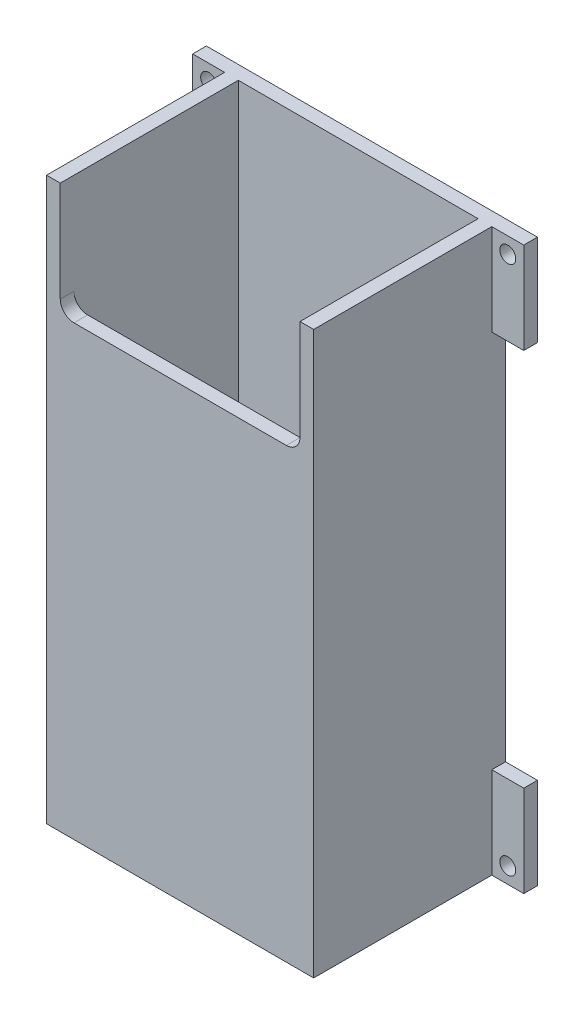
ISO-10303-21;
HEADER;
FILE_DESCRIPTION(('STEP AP214'),'2;1');
FILE_NAME('part.step','',(''),(''),'','','');
FILE_SCHEMA(('AUTOMOTIVE_DESIGN { 1 0 10303 214 1 1 1 1 }'));
ENDSEC;
DATA;
#1=APPLICATION_CONTEXT('core data for automotive mechanical design processes');
#2=APPLICATION_PROTOCOL_DEFINITION('international standard','automotive_design',2000,#1);
#3=PRODUCT_CONTEXT('',#1,'mechanical');
#4=PRODUCT('Part','Part','',(#3));
#5=PRODUCT_RELATED_PRODUCT_CATEGORY('part','',(#4));
#6=PRODUCT_DEFINITION_FORMATION('','',#4);
#7=PRODUCT_DEFINITION_CONTEXT('part definition',#1,'design');
#8=PRODUCT_DEFINITION('design','',#6,#7);
#9=PRODUCT_DEFINITION_SHAPE('','',#8);
#10=(LENGTH_UNIT() NAMED_UNIT(*) SI_UNIT(.MILLI.,.METRE.));
#11=(NAMED_UNIT(*) PLANE_ANGLE_UNIT() SI_UNIT($,.RADIAN.));
#12=(NAMED_UNIT(*) SI_UNIT($,.STERADIAN.) SOLID_ANGLE_UNIT());
#13=UNCERTAINTY_MEASURE_WITH_UNIT(LENGTH_MEASURE(1.E-05),#10,'distance_accuracy_value','');
#14=(GEOMETRIC_REPRESENTATION_CONTEXT(3) GLOBAL_UNCERTAINTY_ASSIGNED_CONTEXT((#13)) GLOBAL_UNIT_ASSIGNED_CONTEXT((#10,
#11,#12)) REPRESENTATION_CONTEXT('',''));
#15=CARTESIAN_POINT('',(0.,0.,0.));
#16=DIRECTION('',(0.,0.,1.));
#17=DIRECTION('',(1.,0.,0.));
#18=AXIS2_PLACEMENT_3D('',#15,#16,#17);
#19=CARTESIAN_POINT('',(0.,123.,-42.));
#20=DIRECTION('',(0.,0.,1.));
#21=DIRECTION('',(1.,0.,0.));
#22=AXIS2_PLACEMENT_3D('',#19,#20,#21);
#23=PLANE('',#22);
#24=DIRECTION('',(0.,-1.,0.));
#25=VECTOR('',#24,1.);
#26=CARTESIAN_POINT('',(58.5,103.,-42.));
#27=LINE('',#26,#25);
#28=CARTESIAN_POINT('',(58.5,103.,-42.));
#29=VERTEX_POINT('',#28);
#30=CARTESIAN_POINT('',(58.5,20.,-42.));
#31=VERTEX_POINT('',#30);
#32=EDGE_CURVE('E247',#29,#31,#27,.T.);
#33=ORIENTED_EDGE('',*,*,#32,.T.);
#34=DIRECTION('',(-1.,0.,0.));
#35=VECTOR('',#34,1.);
#36=CARTESIAN_POINT('',(65.5,20.,-42.));
#37=LINE('',#36,#35);
#38=CARTESIAN_POINT('',(65.5,20.,-42.));
#39=VERTEX_POINT('',#38);
#40=EDGE_CURVE('E243',#39,#31,#37,.T.);
#41=ORIENTED_EDGE('',*,*,#40,.F.);
#42=DIRECTION('',(0.,-1.,0.));
#43=VECTOR('',#42,1.);
#44=CARTESIAN_POINT('',(65.5,0.,-42.));
#45=LINE('',#44,#43);
#46=CARTESIAN_POINT('',(65.5,0.,-42.));
#47=VERTEX_POINT('',#46);
#48=EDGE_CURVE('E352',#39,#47,#45,.T.);
#49=ORIENTED_EDGE('',*,*,#48,.T.);
#50=DIRECTION('',(-1.,0.,0.));
#51=VECTOR('',#50,1.);
#52=CARTESIAN_POINT('',(0.,0.,-42.));
#53=LINE('',#52,#51);
#54=CARTESIAN_POINT('',(-7.,0.,-42.));
#55=VERTEX_POINT('',#54);
#56=EDGE_CURVE('E424',#47,#55,#53,.T.);
#57=ORIENTED_EDGE('',*,*,#56,.T.);
#58=DIRECTION('',(0.,-1.,0.));
#59=VECTOR('',#58,1.);
#60=CARTESIAN_POINT('',(-7.,0.,-42.));
#61=LINE('',#60,#59);
#62=CARTESIAN_POINT('',(-7.00000000000001,20.,-42.));
#63=VERTEX_POINT('',#62);
#64=EDGE_CURVE('E325',#63,#55,#61,.T.);
#65=ORIENTED_EDGE('',*,*,#64,.F.);
#66=DIRECTION('',(1.,0.,0.));
#67=VECTOR('',#66,1.);
#68=CARTESIAN_POINT('',(-7.00000000000001,20.,-42.));
#69=LINE('',#68,#67);
#70=CARTESIAN_POINT('',(0.,20.,-42.));
#71=VERTEX_POINT('',#70);
#72=EDGE_CURVE('E248',#63,#71,#69,.T.);
#73=ORIENTED_EDGE('',*,*,#72,.T.);
#74=DIRECTION('',(0.,-1.,0.));
#75=VECTOR('',#74,1.);
#76=CARTESIAN_POINT('',(0.,103.,-42.));
#77=LINE('',#76,#75);
#78=CARTESIAN_POINT('',(0.,103.,-42.));
#79=VERTEX_POINT('',#78);
#80=EDGE_CURVE('E285',#79,#71,#77,.T.);
#81=ORIENTED_EDGE('',*,*,#80,.F.);
#82=DIRECTION('',(1.,0.,0.));
#83=VECTOR('',#82,1.);
#84=CARTESIAN_POINT('',(-7.,103.,-42.));
#85=LINE('',#84,#83);
#86=CARTESIAN_POINT('',(-7.,103.,-42.));
#87=VERTEX_POINT('',#86);
#88=EDGE_CURVE('E281',#87,#79,#85,.T.);
#89=ORIENTED_EDGE('',*,*,#88,.F.);
#90=CARTESIAN_POINT('',(-7.,123.,-42.));
#91=VERTEX_POINT('',#90);
#92=EDGE_CURVE('E344',#91,#87,#61,.T.);
#93=ORIENTED_EDGE('',*,*,#92,.F.);
#94=DIRECTION('',(-1.,0.,0.));
#95=VECTOR('',#94,1.);
#96=CARTESIAN_POINT('',(0.,123.,-42.));
#97=LINE('',#96,#95);
#98=CARTESIAN_POINT('',(65.5,123.,-42.));
#99=VERTEX_POINT('',#98);
#100=EDGE_CURVE('E433',#99,#91,#97,.T.);
#101=ORIENTED_EDGE('',*,*,#100,.F.);
#102=CARTESIAN_POINT('',(65.5,103.,-42.));
#103=VERTEX_POINT('',#102);
#104=EDGE_CURVE('E375',#99,#103,#45,.T.);
#105=ORIENTED_EDGE('',*,*,#104,.T.);
#106=DIRECTION('',(-1.,0.,0.));
#107=VECTOR('',#106,1.);
#108=CARTESIAN_POINT('',(65.5,103.,-42.));
#109=LINE('',#108,#107);
#110=EDGE_CURVE('E238',#103,#29,#109,.T.);
#111=ORIENTED_EDGE('',*,*,#110,.T.);
#112=EDGE_LOOP('',(#33,#41,#49,#57,#65,#73,#81,#89,#93,#101,#105,#111));
#113=FACE_BOUND('',#112,.T.);
#114=CARTESIAN_POINT('',(62.,119.5,-42.));
#115=DIRECTION('',(0.,0.,-1.));
#116=DIRECTION('',(-1.,0.,0.));
#117=AXIS2_PLACEMENT_3D('',#114,#115,#116);
#118=CIRCLE('',#117,1.75000000000002);
#119=CARTESIAN_POINT('',(60.25,119.5,-42.));
#120=VERTEX_POINT('',#119);
#121=EDGE_CURVE('E317',#120,#120,#118,.T.);
#122=ORIENTED_EDGE('',*,*,#121,.F.);
#123=EDGE_LOOP('',(#122));
#124=FACE_BOUND('',#123,.T.);
#125=CARTESIAN_POINT('',(-3.5,119.5,-42.));
#126=DIRECTION('',(0.,0.,-1.));
#127=DIRECTION('',(-1.,0.,0.));
#128=AXIS2_PLACEMENT_3D('',#125,#126,#127);
#129=CIRCLE('',#128,1.75000000000001);
#130=CARTESIAN_POINT('',(-5.25000000000001,119.5,-42.));
#131=VERTEX_POINT('',#130);
#132=EDGE_CURVE('E309',#131,#131,#129,.T.);
#133=ORIENTED_EDGE('',*,*,#132,.F.);
#134=EDGE_LOOP('',(#133));
#135=FACE_BOUND('',#134,.T.);
#136=CARTESIAN_POINT('',(-3.5,3.5,-42.));
#137=DIRECTION('',(0.,0.,-1.));
#138=DIRECTION('',(-1.,0.,0.));
#139=AXIS2_PLACEMENT_3D('',#136,#137,#138);
#140=CIRCLE('',#139,1.75000000000001);
#141=CARTESIAN_POINT('',(-5.25000000000002,3.5,-42.));
#142=VERTEX_POINT('',#141);
#143=EDGE_CURVE('E305',#142,#142,#140,.T.);
#144=ORIENTED_EDGE('',*,*,#143,.F.);
#145=EDGE_LOOP('',(#144));
#146=FACE_BOUND('',#145,.T.);
#147=CARTESIAN_POINT('',(62.,3.5,-42.));
#148=DIRECTION('',(0.,0.,-1.));
#149=DIRECTION('',(-1.,0.,0.));
#150=AXIS2_PLACEMENT_3D('',#147,#148,#149);
#151=CIRCLE('',#150,1.75000000000002);
#152=CARTESIAN_POINT('',(60.25,3.5,-42.));
#153=VERTEX_POINT('',#152);
#154=EDGE_CURVE('E258',#153,#153,#151,.T.);
#155=ORIENTED_EDGE('',*,*,#154,.F.);
#156=EDGE_LOOP('',(#155));
#157=FACE_BOUND('',#156,.T.);
#158=ADVANCED_FACE('F45',(#113,#124,#135,#146,#157),#23,.F.);
#159=CARTESIAN_POINT('',(65.5,0.,-39.));
#160=DIRECTION('',(1.,0.,0.));
#161=DIRECTION('',(0.,0.,-1.));
#162=AXIS2_PLACEMENT_3D('',#159,#160,#161);
#163=PLANE('',#162);
#164=DIRECTION('',(0.,-1.,0.));
#165=VECTOR('',#164,1.);
#166=CARTESIAN_POINT('',(65.5,0.,-39.));
#167=LINE('',#166,#165);
#168=CARTESIAN_POINT('',(65.5,123.,-39.));
#169=VERTEX_POINT('',#168);
#170=CARTESIAN_POINT('',(65.5,103.,-39.));
#171=VERTEX_POINT('',#170);
#172=EDGE_CURVE('E356',#169,#171,#167,.T.);
#173=ORIENTED_EDGE('',*,*,#172,.T.);
#174=DIRECTION('',(0.,0.,-1.));
#175=VECTOR('',#174,1.);
#176=CARTESIAN_POINT('',(65.5,103.,-39.));
#177=LINE('',#176,#175);
#178=EDGE_CURVE('E259',#171,#103,#177,.T.);
#179=ORIENTED_EDGE('',*,*,#178,.T.);
#180=ORIENTED_EDGE('',*,*,#104,.F.);
#181=DIRECTION('',(0.,0.,-1.));
#182=VECTOR('',#181,1.);
#183=CARTESIAN_POINT('',(65.5,123.,-39.));
#184=LINE('',#183,#182);
#185=EDGE_CURVE('E379',#169,#99,#184,.T.);
#186=ORIENTED_EDGE('',*,*,#185,.F.);
#187=EDGE_LOOP('',(#173,#179,#180,#186));
#188=FACE_BOUND('',#187,.T.);
#189=ADVANCED_FACE('F552',(#188),#163,.T.);
#190=CARTESIAN_POINT('',(0.,0.,-39.));
#191=DIRECTION('',(0.,0.,-1.));
#192=DIRECTION('',(-1.,0.,0.));
#193=AXIS2_PLACEMENT_3D('',#190,#191,#192);
#194=PLANE('',#193);
#195=CARTESIAN_POINT('',(62.,119.5,-39.));
#196=DIRECTION('',(0.,0.,-1.));
#197=DIRECTION('',(-1.,0.,0.));
#198=AXIS2_PLACEMENT_3D('',#195,#196,#197);
#199=CIRCLE('',#198,1.75000000000001);
#200=CARTESIAN_POINT('',(60.25,119.5,-39.));
#201=VERTEX_POINT('',#200);
#202=EDGE_CURVE('E321',#201,#201,#199,.T.);
#203=ORIENTED_EDGE('',*,*,#202,.T.);
#204=EDGE_LOOP('',(#203));
#205=FACE_BOUND('',#204,.T.);
#206=DIRECTION('',(-1.,0.,0.));
#207=VECTOR('',#206,1.);
#208=CARTESIAN_POINT('',(65.5,103.,-39.));
#209=LINE('',#208,#207);
#210=CARTESIAN_POINT('',(58.5,103.,-39.));
#211=VERTEX_POINT('',#210);
#212=EDGE_CURVE('E237',#171,#211,#209,.T.);
#213=ORIENTED_EDGE('',*,*,#212,.F.);
#214=ORIENTED_EDGE('',*,*,#172,.F.);
#215=DIRECTION('',(-1.,0.,0.));
#216=VECTOR('',#215,1.);
#217=CARTESIAN_POINT('',(0.,123.,-39.));
#218=LINE('',#217,#216);
#219=CARTESIAN_POINT('',(58.5,123.,-39.));
#220=VERTEX_POINT('',#219);
#221=EDGE_CURVE('E370',#169,#220,#218,.T.);
#222=ORIENTED_EDGE('',*,*,#221,.T.);
#223=DIRECTION('',(0.,-1.,0.));
#224=VECTOR('',#223,1.);
#225=CARTESIAN_POINT('',(58.5,0.,-39.));
#226=LINE('',#225,#224);
#227=EDGE_CURVE('E366',#220,#211,#226,.T.);
#228=ORIENTED_EDGE('',*,*,#227,.T.);
#229=EDGE_LOOP('',(#213,#214,#222,#228));
#230=FACE_BOUND('',#229,.T.);
#231=ADVANCED_FACE('F550',(#205,#230),#194,.F.);
#232=CARTESIAN_POINT('',(-7.,0.,-39.));
#233=DIRECTION('',(1.,0.,0.));
#234=DIRECTION('',(0.,0.,-1.));
#235=AXIS2_PLACEMENT_3D('',#232,#233,#234);
#236=PLANE('',#235);
#237=DIRECTION('',(0.,0.,-1.));
#238=VECTOR('',#237,1.);
#239=CARTESIAN_POINT('',(-7.00000000000001,20.,-39.));
#240=LINE('',#239,#238);
#241=CARTESIAN_POINT('',(-7.00000000000001,20.,-39.));
#242=VERTEX_POINT('',#241);
#243=EDGE_CURVE('E276',#242,#63,#240,.T.);
#244=ORIENTED_EDGE('',*,*,#243,.T.);
#245=ORIENTED_EDGE('',*,*,#64,.T.);
#246=DIRECTION('',(0.,0.,-1.));
#247=VECTOR('',#246,1.);
#248=CARTESIAN_POINT('',(-7.,0.,-39.));
#249=LINE('',#248,#247);
#250=CARTESIAN_POINT('',(-7.,0.,-39.));
#251=VERTEX_POINT('',#250);
#252=EDGE_CURVE('E348',#251,#55,#249,.T.);
#253=ORIENTED_EDGE('',*,*,#252,.F.);
#254=DIRECTION('',(0.,-1.,0.));
#255=VECTOR('',#254,1.);
#256=CARTESIAN_POINT('',(-7.,0.,-39.));
#257=LINE('',#256,#255);
#258=EDGE_CURVE('E331',#242,#251,#257,.T.);
#259=ORIENTED_EDGE('',*,*,#258,.F.);
#260=EDGE_LOOP('',(#244,#245,#253,#259));
#261=FACE_BOUND('',#260,.T.);
#262=ADVANCED_FACE('F508',(#261),#236,.F.);
#263=CARTESIAN_POINT('',(0.,0.,-39.));
#264=DIRECTION('',(0.,0.,-1.));
#265=DIRECTION('',(-1.,0.,0.));
#266=AXIS2_PLACEMENT_3D('',#263,#264,#265);
#267=PLANE('',#266);
#268=CARTESIAN_POINT('',(-3.5,3.5,-39.));
#269=DIRECTION('',(0.,0.,-1.));
#270=DIRECTION('',(-1.,0.,0.));
#271=AXIS2_PLACEMENT_3D('',#268,#269,#270);
#272=CIRCLE('',#271,1.75000000000001);
#273=CARTESIAN_POINT('',(-5.25000000000001,3.5,-39.));
#274=VERTEX_POINT('',#273);
#275=EDGE_CURVE('E49',#274,#274,#272,.T.);
#276=ORIENTED_EDGE('',*,*,#275,.T.);
#277=EDGE_LOOP('',(#276));
#278=FACE_BOUND('',#277,.T.);
#279=DIRECTION('',(1.,0.,0.));
#280=VECTOR('',#279,1.);
#281=CARTESIAN_POINT('',(-7.00000000000001,20.,-39.));
#282=LINE('',#281,#280);
#283=CARTESIAN_POINT('',(0.,20.,-39.));
#284=VERTEX_POINT('',#283);
#285=EDGE_CURVE('E286',#242,#284,#282,.T.);
#286=ORIENTED_EDGE('',*,*,#285,.F.);
#287=ORIENTED_EDGE('',*,*,#258,.T.);
#288=DIRECTION('',(-1.,0.,0.));
#289=VECTOR('',#288,1.);
#290=CARTESIAN_POINT('',(0.,0.,-39.));
#291=LINE('',#290,#289);
#292=CARTESIAN_POINT('',(0.,0.,-39.));
#293=VERTEX_POINT('',#292);
#294=EDGE_CURVE('E339',#293,#251,#291,.T.);
#295=ORIENTED_EDGE('',*,*,#294,.F.);
#296=DIRECTION('',(0.,1.,0.));
#297=VECTOR('',#296,1.);
#298=CARTESIAN_POINT('',(0.,0.,-39.));
#299=LINE('',#298,#297);
#300=EDGE_CURVE('E335',#293,#284,#299,.T.);
#301=ORIENTED_EDGE('',*,*,#300,.T.);
#302=EDGE_LOOP('',(#286,#287,#295,#301));
#303=FACE_BOUND('',#302,.T.);
#304=ADVANCED_FACE('F506',(#278,#303),#267,.F.);
#305=CARTESIAN_POINT('',(0.,123.,0.));
#306=DIRECTION('',(1.,0.,0.));
#307=DIRECTION('',(0.,0.,-1.));
#308=AXIS2_PLACEMENT_3D('',#305,#306,#307);
#309=PLANE('',#308);
#310=ORIENTED_EDGE('',*,*,#300,.F.);
#311=DIRECTION('',(0.,0.,1.));
#312=VECTOR('',#311,1.);
#313=CARTESIAN_POINT('',(0.,0.,0.));
#314=LINE('',#313,#312);
#315=CARTESIAN_POINT('',(0.,0.,0.));
#316=VERTEX_POINT('',#315);
#317=EDGE_CURVE('E415',#293,#316,#314,.T.);
#318=ORIENTED_EDGE('',*,*,#317,.T.);
#319=DIRECTION('',(0.,-1.,0.));
#320=VECTOR('',#319,1.);
#321=CARTESIAN_POINT('',(0.,123.,0.));
#322=LINE('',#321,#320);
#323=CARTESIAN_POINT('',(0.,123.,0.));
#324=VERTEX_POINT('',#323);
#325=EDGE_CURVE('E452',#324,#316,#322,.T.);
#326=ORIENTED_EDGE('',*,*,#325,.F.);
#327=DIRECTION('',(0.,0.,1.));
#328=VECTOR('',#327,1.);
#329=CARTESIAN_POINT('',(0.,123.,0.));
#330=LINE('',#329,#328);
#331=CARTESIAN_POINT('',(0.,123.,-39.));
#332=VERTEX_POINT('',#331);
#333=EDGE_CURVE('E420',#332,#324,#330,.T.);
#334=ORIENTED_EDGE('',*,*,#333,.F.);
#335=CARTESIAN_POINT('',(0.,103.,-39.));
#336=VERTEX_POINT('',#335);
#337=EDGE_CURVE('E334',#336,#332,#299,.T.);
#338=ORIENTED_EDGE('',*,*,#337,.F.);
#339=DIRECTION('',(0.,0.,-1.));
#340=VECTOR('',#339,1.);
#341=CARTESIAN_POINT('',(0.,103.,-39.));
#342=LINE('',#341,#340);
#343=EDGE_CURVE('E270',#336,#79,#342,.T.);
#344=ORIENTED_EDGE('',*,*,#343,.T.);
#345=ORIENTED_EDGE('',*,*,#80,.T.);
#346=DIRECTION('',(0.,0.,-1.));
#347=VECTOR('',#346,1.);
#348=CARTESIAN_POINT('',(0.,20.,-39.));
#349=LINE('',#348,#347);
#350=EDGE_CURVE('E232',#284,#71,#349,.T.);
#351=ORIENTED_EDGE('',*,*,#350,.F.);
#352=EDGE_LOOP('',(#310,#318,#326,#334,#338,#344,#345,#351));
#353=FACE_BOUND('',#352,.T.);
#354=ADVANCED_FACE('F518',(#353),#309,.F.);
#355=CARTESIAN_POINT('',(58.5,123.,0.));
#356=DIRECTION('',(-1.,0.,0.));
#357=DIRECTION('',(0.,0.,1.));
#358=AXIS2_PLACEMENT_3D('',#355,#356,#357);
#359=PLANE('',#358);
#360=ORIENTED_EDGE('',*,*,#227,.F.);
#361=DIRECTION('',(0.,0.,-1.));
#362=VECTOR('',#361,1.);
#363=CARTESIAN_POINT('',(58.5,123.,0.));
#364=LINE('',#363,#362);
#365=CARTESIAN_POINT('',(58.5,123.,0.));
#366=VERTEX_POINT('',#365);
#367=EDGE_CURVE('E429',#366,#220,#364,.T.);
#368=ORIENTED_EDGE('',*,*,#367,.F.);
#369=DIRECTION('',(0.,-1.,0.));
#370=VECTOR('',#369,1.);
#371=CARTESIAN_POINT('',(58.5,123.,0.));
#372=LINE('',#371,#370);
#373=CARTESIAN_POINT('',(58.5,0.,0.));
#374=VERTEX_POINT('',#373);
#375=EDGE_CURVE('E436',#366,#374,#372,.T.);
#376=ORIENTED_EDGE('',*,*,#375,.T.);
#377=DIRECTION('',(0.,0.,-1.));
#378=VECTOR('',#377,1.);
#379=CARTESIAN_POINT('',(58.5,0.,0.));
#380=LINE('',#379,#378);
#381=CARTESIAN_POINT('',(58.5,0.,-39.));
#382=VERTEX_POINT('',#381);
#383=EDGE_CURVE('E442',#374,#382,#380,.T.);
#384=ORIENTED_EDGE('',*,*,#383,.T.);
#385=CARTESIAN_POINT('',(58.5,20.,-39.));
#386=VERTEX_POINT('',#385);
#387=EDGE_CURVE('E365',#386,#382,#226,.T.);
#388=ORIENTED_EDGE('',*,*,#387,.F.);
#389=DIRECTION('',(0.,0.,-1.));
#390=VECTOR('',#389,1.);
#391=CARTESIAN_POINT('',(58.5,20.,-39.));
#392=LINE('',#391,#390);
#393=EDGE_CURVE('E242',#386,#31,#392,.T.);
#394=ORIENTED_EDGE('',*,*,#393,.T.);
#395=ORIENTED_EDGE('',*,*,#32,.F.);
#396=DIRECTION('',(0.,0.,-1.));
#397=VECTOR('',#396,1.);
#398=CARTESIAN_POINT('',(58.5,103.,-39.));
#399=LINE('',#398,#397);
#400=EDGE_CURVE('E263',#211,#29,#399,.T.);
#401=ORIENTED_EDGE('',*,*,#400,.F.);
#402=EDGE_LOOP('',(#360,#368,#376,#384,#388,#394,#395,#401));
#403=FACE_BOUND('',#402,.T.);
#404=ADVANCED_FACE('F544',(#403),#359,.F.);
#405=CARTESIAN_POINT('',(0.,3.,-3.00000000000001));
#406=DIRECTION('',(0.,0.,1.));
#407=DIRECTION('',(1.,0.,0.));
#408=AXIS2_PLACEMENT_3D('',#405,#406,#407);
#409=PLANE('',#408);
#410=DIRECTION('',(0.,1.,0.));
#411=VECTOR('',#410,1.);
#412=CARTESIAN_POINT('',(55.5,3.,-3.00000000000001));
#413=LINE('',#412,#411);
#414=CARTESIAN_POINT('',(55.5,13.,-3.00000000000001));
#415=VERTEX_POINT('',#414);
#416=CARTESIAN_POINT('',(55.5,101.,-3.00000000000001));
#417=VERTEX_POINT('',#416);
#418=EDGE_CURVE('E218',#415,#417,#413,.T.);
#419=ORIENTED_EDGE('',*,*,#418,.F.);
#420=DIRECTION('',(1.,0.,0.));
#421=VECTOR('',#420,1.);
#422=CARTESIAN_POINT('',(2.99999999999999,13.,-3.00000000000001));
#423=LINE('',#422,#421);
#424=CARTESIAN_POINT('',(2.99999999999999,13.,-3.00000000000001));
#425=VERTEX_POINT('',#424);
#426=EDGE_CURVE('E222',#425,#415,#423,.T.);
#427=ORIENTED_EDGE('',*,*,#426,.F.);
#428=DIRECTION('',(0.,1.,0.));
#429=VECTOR('',#428,1.);
#430=CARTESIAN_POINT('',(2.99999999999999,3.,-3.00000000000001));
#431=LINE('',#430,#429);
#432=CARTESIAN_POINT('',(2.99999999999999,101.,-3.00000000000001));
#433=VERTEX_POINT('',#432);
#434=EDGE_CURVE('E207',#425,#433,#431,.T.);
#435=ORIENTED_EDGE('',*,*,#434,.T.);
#436=CARTESIAN_POINT('',(5.99999999999999,101.,-3.00000000000001));
#437=DIRECTION('',(0.,0.,1.));
#438=DIRECTION('',(1.,0.,0.));
#439=AXIS2_PLACEMENT_3D('',#436,#437,#438);
#440=CIRCLE('',#439,3.);
#441=CARTESIAN_POINT('',(5.99999999999999,98.,-3.00000000000001));
#442=VERTEX_POINT('',#441);
#443=EDGE_CURVE('E11',#433,#442,#440,.T.);
#444=ORIENTED_EDGE('',*,*,#443,.T.);
#445=DIRECTION('',(-1.,0.,0.));
#446=VECTOR('',#445,1.);
#447=CARTESIAN_POINT('',(2.99999999999999,98.,-3.00000000000001));
#448=LINE('',#447,#446);
#449=CARTESIAN_POINT('',(52.5,98.,-3.00000000000001));
#450=VERTEX_POINT('',#449);
#451=EDGE_CURVE('E390',#450,#442,#448,.T.);
#452=ORIENTED_EDGE('',*,*,#451,.F.);
#453=CARTESIAN_POINT('',(52.5,101.,-3.00000000000001));
#454=DIRECTION('',(0.,0.,1.));
#455=DIRECTION('',(1.,0.,0.));
#456=AXIS2_PLACEMENT_3D('',#453,#454,#455);
#457=CIRCLE('',#456,3.);
#458=EDGE_CURVE('E469',#450,#417,#457,.T.);
#459=ORIENTED_EDGE('',*,*,#458,.T.);
#460=EDGE_LOOP('',(#419,#427,#435,#444,#452,#459));
#461=FACE_BOUND('',#460,.T.);
#462=ADVANCED_FACE('F223',(#461),#409,.F.);
#463=CARTESIAN_POINT('',(0.,123.,0.));
#464=DIRECTION('',(0.,-1.,0.));
#465=DIRECTION('',(0.,0.,-1.));
#466=AXIS2_PLACEMENT_3D('',#463,#464,#465);
#467=PLANE('',#466);
#468=DIRECTION('',(1.,0.,0.));
#469=VECTOR('',#468,1.);
#470=CARTESIAN_POINT('',(0.,123.,0.));
#471=LINE('',#470,#469);
#472=CARTESIAN_POINT('',(2.99999999999999,123.,0.));
#473=VERTEX_POINT('',#472);
#474=EDGE_CURVE('E425',#324,#473,#471,.T.);
#475=ORIENTED_EDGE('',*,*,#474,.T.);
#476=DIRECTION('',(0.,0.,-1.));
#477=VECTOR('',#476,1.);
#478=CARTESIAN_POINT('',(2.99999999999999,123.,0.));
#479=LINE('',#478,#477);
#480=CARTESIAN_POINT('',(2.99999999999999,123.,-39.));
#481=VERTEX_POINT('',#480);
#482=EDGE_CURVE('E404',#473,#481,#479,.T.);
#483=ORIENTED_EDGE('',*,*,#482,.T.);
#484=DIRECTION('',(1.,0.,0.));
#485=VECTOR('',#484,1.);
#486=CARTESIAN_POINT('',(0.,123.,-39.));
#487=LINE('',#486,#485);
#488=CARTESIAN_POINT('',(55.5,123.,-39.));
#489=VERTEX_POINT('',#488);
#490=EDGE_CURVE('E398',#481,#489,#487,.T.);
#491=ORIENTED_EDGE('',*,*,#490,.T.);
#492=DIRECTION('',(0.,0.,-1.));
#493=VECTOR('',#492,1.);
#494=CARTESIAN_POINT('',(55.5,123.,0.));
#495=LINE('',#494,#493);
#496=CARTESIAN_POINT('',(55.5,123.,0.));
#497=VERTEX_POINT('',#496);
#498=EDGE_CURVE('E408',#497,#489,#495,.T.);
#499=ORIENTED_EDGE('',*,*,#498,.F.);
#500=EDGE_CURVE('E423',#497,#366,#471,.T.);
#501=ORIENTED_EDGE('',*,*,#500,.T.);
#502=ORIENTED_EDGE('',*,*,#367,.T.);
#503=ORIENTED_EDGE('',*,*,#221,.F.);
#504=ORIENTED_EDGE('',*,*,#185,.T.);
#505=ORIENTED_EDGE('',*,*,#100,.T.);
#506=DIRECTION('',(0.,0.,-1.));
#507=VECTOR('',#506,1.);
#508=CARTESIAN_POINT('',(-7.,123.,-39.));
#509=LINE('',#508,#507);
#510=CARTESIAN_POINT('',(-7.,123.,-39.));
#511=VERTEX_POINT('',#510);
#512=EDGE_CURVE('E343',#511,#91,#509,.T.);
#513=ORIENTED_EDGE('',*,*,#512,.F.);
#514=DIRECTION('',(-1.,0.,0.));
#515=VECTOR('',#514,1.);
#516=CARTESIAN_POINT('',(0.,123.,-39.));
#517=LINE('',#516,#515);
#518=EDGE_CURVE('E330',#332,#511,#517,.T.);
#519=ORIENTED_EDGE('',*,*,#518,.F.);
#520=ORIENTED_EDGE('',*,*,#333,.T.);
#521=EDGE_LOOP('',(#475,#483,#491,#499,#501,#502,#503,#504,#505,#513,#519,#520));
#522=FACE_BOUND('',#521,.T.);
#523=ADVANCED_FACE('F546',(#522),#467,.F.);
#524=CARTESIAN_POINT('',(0.,123.,0.));
#525=DIRECTION('',(0.,0.,-1.));
#526=DIRECTION('',(-1.,0.,0.));
#527=AXIS2_PLACEMENT_3D('',#524,#525,#526);
#528=PLANE('',#527);
#529=DIRECTION('',(1.,0.,0.));
#530=VECTOR('',#529,1.);
#531=CARTESIAN_POINT('',(2.99999999999999,98.,0.));
#532=LINE('',#531,#530);
#533=CARTESIAN_POINT('',(5.99999999999999,98.,0.));
#534=VERTEX_POINT('',#533);
#535=CARTESIAN_POINT('',(52.5,98.,0.));
#536=VERTEX_POINT('',#535);
#537=EDGE_CURVE('E383',#534,#536,#532,.T.);
#538=ORIENTED_EDGE('',*,*,#537,.F.);
#539=CARTESIAN_POINT('',(5.99999999999999,101.,0.));
#540=DIRECTION('',(0.,0.,-1.));
#541=DIRECTION('',(-1.,0.,0.));
#542=AXIS2_PLACEMENT_3D('',#539,#540,#541);
#543=CIRCLE('',#542,3.);
#544=CARTESIAN_POINT('',(2.99999999999999,101.,0.));
#545=VERTEX_POINT('',#544);
#546=EDGE_CURVE('E55',#534,#545,#543,.T.);
#547=ORIENTED_EDGE('',*,*,#546,.T.);
#548=DIRECTION('',(0.,1.,0.));
#549=VECTOR('',#548,1.);
#550=CARTESIAN_POINT('',(2.99999999999999,98.,0.));
#551=LINE('',#550,#549);
#552=EDGE_CURVE('E394',#545,#473,#551,.T.);
#553=ORIENTED_EDGE('',*,*,#552,.T.);
#554=ORIENTED_EDGE('',*,*,#474,.F.);
#555=ORIENTED_EDGE('',*,*,#325,.T.);
#556=DIRECTION('',(1.,0.,0.));
#557=VECTOR('',#556,1.);
#558=CARTESIAN_POINT('',(0.,0.,0.));
#559=LINE('',#558,#557);
#560=EDGE_CURVE('E439',#316,#374,#559,.T.);
#561=ORIENTED_EDGE('',*,*,#560,.T.);
#562=ORIENTED_EDGE('',*,*,#375,.F.);
#563=ORIENTED_EDGE('',*,*,#500,.F.);
#564=DIRECTION('',(0.,1.,0.));
#565=VECTOR('',#564,1.);
#566=CARTESIAN_POINT('',(55.5,98.,0.));
#567=LINE('',#566,#565);
#568=CARTESIAN_POINT('',(55.5,101.,0.));
#569=VERTEX_POINT('',#568);
#570=EDGE_CURVE('E395',#569,#497,#567,.T.);
#571=ORIENTED_EDGE('',*,*,#570,.F.);
#572=CARTESIAN_POINT('',(52.5,101.,0.));
#573=DIRECTION('',(0.,0.,-1.));
#574=DIRECTION('',(-1.,0.,0.));
#575=AXIS2_PLACEMENT_3D('',#572,#573,#574);
#576=CIRCLE('',#575,3.);
#577=EDGE_CURVE('E472',#569,#536,#576,.T.);
#578=ORIENTED_EDGE('',*,*,#577,.T.);
#579=EDGE_LOOP('',(#538,#547,#553,#554,#555,#561,#562,#563,#571,#578));
#580=FACE_BOUND('',#579,.T.);
#581=ADVANCED_FACE('F478',(#580),#528,.F.);
#582=CARTESIAN_POINT('',(0.,0.,0.));
#583=DIRECTION('',(0.,-1.,0.));
#584=DIRECTION('',(0.,0.,-1.));
#585=AXIS2_PLACEMENT_3D('',#582,#583,#584);
#586=PLANE('',#585);
#587=ORIENTED_EDGE('',*,*,#317,.F.);
#588=ORIENTED_EDGE('',*,*,#294,.T.);
#589=ORIENTED_EDGE('',*,*,#252,.T.);
#590=ORIENTED_EDGE('',*,*,#56,.F.);
#591=DIRECTION('',(0.,0.,-1.));
#592=VECTOR('',#591,1.);
#593=CARTESIAN_POINT('',(65.5,0.,-39.));
#594=LINE('',#593,#592);
#595=CARTESIAN_POINT('',(65.5,0.,-39.));
#596=VERTEX_POINT('',#595);
#597=EDGE_CURVE('E374',#596,#47,#594,.T.);
#598=ORIENTED_EDGE('',*,*,#597,.F.);
#599=DIRECTION('',(-1.,0.,0.));
#600=VECTOR('',#599,1.);
#601=CARTESIAN_POINT('',(0.,0.,-39.));
#602=LINE('',#601,#600);
#603=EDGE_CURVE('E360',#596,#382,#602,.T.);
#604=ORIENTED_EDGE('',*,*,#603,.T.);
#605=ORIENTED_EDGE('',*,*,#383,.F.);
#606=ORIENTED_EDGE('',*,*,#560,.F.);
#607=EDGE_LOOP('',(#587,#588,#589,#590,#598,#604,#605,#606));
#608=FACE_BOUND('',#607,.T.);
#609=ADVANCED_FACE('F513',(#608),#586,.T.);
#610=CARTESIAN_POINT('',(0.,3.,-39.));
#611=DIRECTION('',(0.,0.,1.));
#612=DIRECTION('',(1.,0.,0.));
#613=AXIS2_PLACEMENT_3D('',#610,#611,#612);
#614=PLANE('',#613);
#615=DIRECTION('',(-1.,0.,0.));
#616=VECTOR('',#615,1.);
#617=CARTESIAN_POINT('',(2.99999999999999,13.,-39.));
#618=LINE('',#617,#616);
#619=CARTESIAN_POINT('',(55.5,13.,-39.));
#620=VERTEX_POINT('',#619);
#621=CARTESIAN_POINT('',(2.99999999999999,13.,-39.));
#622=VERTEX_POINT('',#621);
#623=EDGE_CURVE('E62',#620,#622,#618,.T.);
#624=ORIENTED_EDGE('',*,*,#623,.F.);
#625=DIRECTION('',(0.,1.,0.));
#626=VECTOR('',#625,1.);
#627=CARTESIAN_POINT('',(55.5,3.,-39.));
#628=LINE('',#627,#626);
#629=EDGE_CURVE('E412',#620,#489,#628,.T.);
#630=ORIENTED_EDGE('',*,*,#629,.T.);
#631=ORIENTED_EDGE('',*,*,#490,.F.);
#632=DIRECTION('',(0.,1.,0.));
#633=VECTOR('',#632,1.);
#634=CARTESIAN_POINT('',(2.99999999999999,3.,-39.));
#635=LINE('',#634,#633);
#636=EDGE_CURVE('E219',#622,#481,#635,.T.);
#637=ORIENTED_EDGE('',*,*,#636,.F.);
#638=EDGE_LOOP('',(#624,#630,#631,#637));
#639=FACE_BOUND('',#638,.T.);
#640=ADVANCED_FACE('F568',(#639),#614,.T.);
#641=CARTESIAN_POINT('',(55.5,3.,0.));
#642=DIRECTION('',(1.,0.,0.));
#643=DIRECTION('',(0.,0.,-1.));
#644=AXIS2_PLACEMENT_3D('',#641,#642,#643);
#645=PLANE('',#644);
#646=ORIENTED_EDGE('',*,*,#629,.F.);
#647=DIRECTION('',(0.,0.,-1.));
#648=VECTOR('',#647,1.);
#649=CARTESIAN_POINT('',(55.5,13.,-39.));
#650=LINE('',#649,#648);
#651=EDGE_CURVE('E69',#415,#620,#650,.T.);
#652=ORIENTED_EDGE('',*,*,#651,.F.);
#653=ORIENTED_EDGE('',*,*,#418,.T.);
#654=DIRECTION('',(0.,0.,-1.));
#655=VECTOR('',#654,1.);
#656=CARTESIAN_POINT('',(55.5,101.,0.));
#657=LINE('',#656,#655);
#658=EDGE_CURVE('E464',#417,#569,#657,.F.);
#659=ORIENTED_EDGE('',*,*,#658,.T.);
#660=ORIENTED_EDGE('',*,*,#570,.T.);
#661=ORIENTED_EDGE('',*,*,#498,.T.);
#662=EDGE_LOOP('',(#646,#652,#653,#659,#660,#661));
#663=FACE_BOUND('',#662,.T.);
#664=ADVANCED_FACE('F492',(#663),#645,.F.);
#665=CARTESIAN_POINT('',(2.99999999999999,3.,0.));
#666=DIRECTION('',(1.,0.,0.));
#667=DIRECTION('',(0.,0.,-1.));
#668=AXIS2_PLACEMENT_3D('',#665,#666,#667);
#669=PLANE('',#668);
#670=DIRECTION('',(0.,0.,1.));
#671=VECTOR('',#670,1.);
#672=CARTESIAN_POINT('',(2.99999999999999,13.,-39.));
#673=LINE('',#672,#671);
#674=EDGE_CURVE('E211',#622,#425,#673,.T.);
#675=ORIENTED_EDGE('',*,*,#674,.F.);
#676=ORIENTED_EDGE('',*,*,#636,.T.);
#677=ORIENTED_EDGE('',*,*,#482,.F.);
#678=ORIENTED_EDGE('',*,*,#552,.F.);
#679=DIRECTION('',(0.,0.,1.));
#680=VECTOR('',#679,1.);
#681=CARTESIAN_POINT('',(2.99999999999999,101.,-3.00000000000001));
#682=LINE('',#681,#680);
#683=EDGE_CURVE('E214',#545,#433,#682,.F.);
#684=ORIENTED_EDGE('',*,*,#683,.T.);
#685=ORIENTED_EDGE('',*,*,#434,.F.);
#686=EDGE_LOOP('',(#675,#676,#677,#678,#684,#685));
#687=FACE_BOUND('',#686,.T.);
#688=ADVANCED_FACE('F209',(#687),#669,.T.);
#689=CARTESIAN_POINT('',(0.,98.,0.));
#690=DIRECTION('',(0.,1.,0.));
#691=DIRECTION('',(0.,0.,1.));
#692=AXIS2_PLACEMENT_3D('',#689,#690,#691);
#693=PLANE('',#692);
#694=ORIENTED_EDGE('',*,*,#537,.T.);
#695=DIRECTION('',(0.,0.,-1.));
#696=VECTOR('',#695,1.);
#697=CARTESIAN_POINT('',(52.5,98.,0.));
#698=LINE('',#697,#696);
#699=EDGE_CURVE('E460',#536,#450,#698,.T.);
#700=ORIENTED_EDGE('',*,*,#699,.T.);
#701=ORIENTED_EDGE('',*,*,#451,.T.);
#702=DIRECTION('',(0.,0.,1.));
#703=VECTOR('',#702,1.);
#704=CARTESIAN_POINT('',(5.99999999999999,98.,0.));
#705=LINE('',#704,#703);
#706=EDGE_CURVE('E456',#442,#534,#705,.T.);
#707=ORIENTED_EDGE('',*,*,#706,.T.);
#708=EDGE_LOOP('',(#694,#700,#701,#707));
#709=FACE_BOUND('',#708,.T.);
#710=ADVANCED_FACE('F485',(#709),#693,.T.);
#711=CARTESIAN_POINT('',(52.5,101.,0.));
#712=DIRECTION('',(0.,0.,-1.));
#713=DIRECTION('',(-1.,0.,0.));
#714=AXIS2_PLACEMENT_3D('',#711,#712,#713);
#715=CYLINDRICAL_SURFACE('',#714,3.);
#716=ORIENTED_EDGE('',*,*,#577,.F.);
#717=ORIENTED_EDGE('',*,*,#658,.F.);
#718=ORIENTED_EDGE('',*,*,#458,.F.);
#719=ORIENTED_EDGE('',*,*,#699,.F.);
#720=EDGE_LOOP('',(#716,#717,#718,#719));
#721=FACE_BOUND('',#720,.T.);
#722=ADVANCED_FACE('F489',(#721),#715,.F.);
#723=CARTESIAN_POINT('',(5.99999999999999,101.,0.));
#724=DIRECTION('',(0.,0.,-1.));
#725=DIRECTION('',(-1.,0.,0.));
#726=AXIS2_PLACEMENT_3D('',#723,#724,#725);
#727=CYLINDRICAL_SURFACE('',#726,3.);
#728=ORIENTED_EDGE('',*,*,#443,.F.);
#729=ORIENTED_EDGE('',*,*,#683,.F.);
#730=ORIENTED_EDGE('',*,*,#546,.F.);
#731=ORIENTED_EDGE('',*,*,#706,.F.);
#732=EDGE_LOOP('',(#728,#729,#730,#731));
#733=FACE_BOUND('',#732,.T.);
#734=ADVANCED_FACE('F47',(#733),#727,.F.);
#735=DIRECTION('',(0.,0.,-1.));
#736=VECTOR('',#735,1.);
#737=CARTESIAN_POINT('',(65.5,20.,-39.));
#738=LINE('',#737,#736);
#739=CARTESIAN_POINT('',(65.5,20.,-39.));
#740=VERTEX_POINT('',#739);
#741=EDGE_CURVE('E255',#740,#39,#738,.T.);
#742=ORIENTED_EDGE('',*,*,#741,.F.);
#743=EDGE_CURVE('E361',#740,#596,#167,.T.);
#744=ORIENTED_EDGE('',*,*,#743,.T.);
#745=ORIENTED_EDGE('',*,*,#597,.T.);
#746=ORIENTED_EDGE('',*,*,#48,.F.);
#747=EDGE_LOOP('',(#742,#744,#745,#746));
#748=FACE_BOUND('',#747,.T.);
#749=ADVANCED_FACE('F538',(#748),#163,.T.);
#750=CARTESIAN_POINT('',(62.,3.5,-39.));
#751=DIRECTION('',(0.,0.,-1.));
#752=DIRECTION('',(-1.,0.,0.));
#753=AXIS2_PLACEMENT_3D('',#750,#751,#752);
#754=CIRCLE('',#753,1.75000000000001);
#755=CARTESIAN_POINT('',(60.25,3.5,-39.));
#756=VERTEX_POINT('',#755);
#757=EDGE_CURVE('E301',#756,#756,#754,.T.);
#758=ORIENTED_EDGE('',*,*,#757,.T.);
#759=EDGE_LOOP('',(#758));
#760=FACE_BOUND('',#759,.T.);
#761=ORIENTED_EDGE('',*,*,#743,.F.);
#762=DIRECTION('',(-1.,0.,0.));
#763=VECTOR('',#762,1.);
#764=CARTESIAN_POINT('',(65.5,20.,-39.));
#765=LINE('',#764,#763);
#766=EDGE_CURVE('E233',#740,#386,#765,.T.);
#767=ORIENTED_EDGE('',*,*,#766,.T.);
#768=ORIENTED_EDGE('',*,*,#387,.T.);
#769=ORIENTED_EDGE('',*,*,#603,.F.);
#770=EDGE_LOOP('',(#761,#767,#768,#769));
#771=FACE_BOUND('',#770,.T.);
#772=ADVANCED_FACE('F541',(#760,#771),#194,.F.);
#773=ORIENTED_EDGE('',*,*,#92,.T.);
#774=DIRECTION('',(0.,0.,-1.));
#775=VECTOR('',#774,1.);
#776=CARTESIAN_POINT('',(-7.,103.,-39.));
#777=LINE('',#776,#775);
#778=CARTESIAN_POINT('',(-7.,103.,-39.));
#779=VERTEX_POINT('',#778);
#780=EDGE_CURVE('E273',#779,#87,#777,.T.);
#781=ORIENTED_EDGE('',*,*,#780,.F.);
#782=EDGE_CURVE('E326',#511,#779,#257,.T.);
#783=ORIENTED_EDGE('',*,*,#782,.F.);
#784=ORIENTED_EDGE('',*,*,#512,.T.);
#785=EDGE_LOOP('',(#773,#781,#783,#784));
#786=FACE_BOUND('',#785,.T.);
#787=ADVANCED_FACE('F559',(#786),#236,.F.);
#788=CARTESIAN_POINT('',(-3.5,119.5,-39.));
#789=DIRECTION('',(0.,0.,-1.));
#790=DIRECTION('',(-1.,0.,0.));
#791=AXIS2_PLACEMENT_3D('',#788,#789,#790);
#792=CIRCLE('',#791,1.75000000000001);
#793=CARTESIAN_POINT('',(-5.25000000000001,119.5,-39.));
#794=VERTEX_POINT('',#793);
#795=EDGE_CURVE('E313',#794,#794,#792,.T.);
#796=ORIENTED_EDGE('',*,*,#795,.T.);
#797=EDGE_LOOP('',(#796));
#798=FACE_BOUND('',#797,.T.);
#799=ORIENTED_EDGE('',*,*,#782,.T.);
#800=DIRECTION('',(1.,0.,0.));
#801=VECTOR('',#800,1.);
#802=CARTESIAN_POINT('',(-7.,103.,-39.));
#803=LINE('',#802,#801);
#804=EDGE_CURVE('E280',#779,#336,#803,.T.);
#805=ORIENTED_EDGE('',*,*,#804,.T.);
#806=ORIENTED_EDGE('',*,*,#337,.T.);
#807=ORIENTED_EDGE('',*,*,#518,.T.);
#808=EDGE_LOOP('',(#799,#805,#806,#807));
#809=FACE_BOUND('',#808,.T.);
#810=ADVANCED_FACE('F565',(#798,#809),#267,.F.);
#811=CARTESIAN_POINT('',(62.,119.5,-42.));
#812=DIRECTION('',(0.,0.,-1.));
#813=DIRECTION('',(-1.,0.,0.));
#814=AXIS2_PLACEMENT_3D('',#811,#812,#813);
#815=CYLINDRICAL_SURFACE('',#814,1.75000000000001);
#816=ORIENTED_EDGE('',*,*,#121,.T.);
#817=EDGE_LOOP('',(#816));
#818=FACE_BOUND('',#817,.T.);
#819=ORIENTED_EDGE('',*,*,#202,.F.);
#820=EDGE_LOOP('',(#819));
#821=FACE_BOUND('',#820,.T.);
#822=ADVANCED_FACE('F771',(#818,#821),#815,.F.);
#823=CARTESIAN_POINT('',(-3.5,119.5,-42.));
#824=DIRECTION('',(0.,0.,-1.));
#825=DIRECTION('',(-1.,0.,0.));
#826=AXIS2_PLACEMENT_3D('',#823,#824,#825);
#827=CYLINDRICAL_SURFACE('',#826,1.75000000000001);
#828=ORIENTED_EDGE('',*,*,#132,.T.);
#829=EDGE_LOOP('',(#828));
#830=FACE_BOUND('',#829,.T.);
#831=ORIENTED_EDGE('',*,*,#795,.F.);
#832=EDGE_LOOP('',(#831));
#833=FACE_BOUND('',#832,.T.);
#834=ADVANCED_FACE('F761',(#830,#833),#827,.F.);
#835=CARTESIAN_POINT('',(-3.5,3.5,-42.));
#836=DIRECTION('',(0.,0.,-1.));
#837=DIRECTION('',(-1.,0.,0.));
#838=AXIS2_PLACEMENT_3D('',#835,#836,#837);
#839=CYLINDRICAL_SURFACE('',#838,1.75000000000001);
#840=ORIENTED_EDGE('',*,*,#143,.T.);
#841=EDGE_LOOP('',(#840));
#842=FACE_BOUND('',#841,.T.);
#843=ORIENTED_EDGE('',*,*,#275,.F.);
#844=EDGE_LOOP('',(#843));
#845=FACE_BOUND('',#844,.T.);
#846=ADVANCED_FACE('F752',(#842,#845),#839,.F.);
#847=CARTESIAN_POINT('',(62.,3.5,-42.));
#848=DIRECTION('',(0.,0.,-1.));
#849=DIRECTION('',(-1.,0.,0.));
#850=AXIS2_PLACEMENT_3D('',#847,#848,#849);
#851=CYLINDRICAL_SURFACE('',#850,1.75000000000001);
#852=ORIENTED_EDGE('',*,*,#154,.T.);
#853=EDGE_LOOP('',(#852));
#854=FACE_BOUND('',#853,.T.);
#855=ORIENTED_EDGE('',*,*,#757,.F.);
#856=EDGE_LOOP('',(#855));
#857=FACE_BOUND('',#856,.T.);
#858=ADVANCED_FACE('F680',(#854,#857),#851,.F.);
#859=CARTESIAN_POINT('',(-7.00000000000001,20.,-39.));
#860=DIRECTION('',(0.,1.,0.));
#861=DIRECTION('',(0.,0.,1.));
#862=AXIS2_PLACEMENT_3D('',#859,#860,#861);
#863=PLANE('',#862);
#864=ORIENTED_EDGE('',*,*,#72,.F.);
#865=ORIENTED_EDGE('',*,*,#243,.F.);
#866=ORIENTED_EDGE('',*,*,#285,.T.);
#867=ORIENTED_EDGE('',*,*,#350,.T.);
#868=EDGE_LOOP('',(#864,#865,#866,#867));
#869=FACE_BOUND('',#868,.T.);
#870=ADVANCED_FACE('F523',(#869),#863,.T.);
#871=CARTESIAN_POINT('',(-7.,103.,-39.));
#872=DIRECTION('',(0.,1.,0.));
#873=DIRECTION('',(0.,0.,1.));
#874=AXIS2_PLACEMENT_3D('',#871,#872,#873);
#875=PLANE('',#874);
#876=ORIENTED_EDGE('',*,*,#88,.T.);
#877=ORIENTED_EDGE('',*,*,#343,.F.);
#878=ORIENTED_EDGE('',*,*,#804,.F.);
#879=ORIENTED_EDGE('',*,*,#780,.T.);
#880=EDGE_LOOP('',(#876,#877,#878,#879));
#881=FACE_BOUND('',#880,.T.);
#882=ADVANCED_FACE('F563',(#881),#875,.F.);
#883=CARTESIAN_POINT('',(65.5,20.,-39.));
#884=DIRECTION('',(0.,-1.,0.));
#885=DIRECTION('',(0.,0.,-1.));
#886=AXIS2_PLACEMENT_3D('',#883,#884,#885);
#887=PLANE('',#886);
#888=ORIENTED_EDGE('',*,*,#40,.T.);
#889=ORIENTED_EDGE('',*,*,#393,.F.);
#890=ORIENTED_EDGE('',*,*,#766,.F.);
#891=ORIENTED_EDGE('',*,*,#741,.T.);
#892=EDGE_LOOP('',(#888,#889,#890,#891));
#893=FACE_BOUND('',#892,.T.);
#894=ADVANCED_FACE('F650',(#893),#887,.F.);
#895=CARTESIAN_POINT('',(65.5,103.,-39.));
#896=DIRECTION('',(0.,-1.,0.));
#897=DIRECTION('',(0.,0.,-1.));
#898=AXIS2_PLACEMENT_3D('',#895,#896,#897);
#899=PLANE('',#898);
#900=ORIENTED_EDGE('',*,*,#110,.F.);
#901=ORIENTED_EDGE('',*,*,#178,.F.);
#902=ORIENTED_EDGE('',*,*,#212,.T.);
#903=ORIENTED_EDGE('',*,*,#400,.T.);
#904=EDGE_LOOP('',(#900,#901,#902,#903));
#905=FACE_BOUND('',#904,.T.);
#906=ADVANCED_FACE('F638',(#905),#899,.T.);
#907=CARTESIAN_POINT('',(0.,13.,0.));
#908=DIRECTION('',(0.,1.,0.));
#909=DIRECTION('',(0.,0.,1.));
#910=AXIS2_PLACEMENT_3D('',#907,#908,#909);
#911=PLANE('',#910);
#912=ORIENTED_EDGE('',*,*,#674,.T.);
#913=ORIENTED_EDGE('',*,*,#426,.T.);
#914=ORIENTED_EDGE('',*,*,#651,.T.);
#915=ORIENTED_EDGE('',*,*,#623,.T.);
#916=EDGE_LOOP('',(#912,#913,#914,#915));
#917=FACE_BOUND('',#916,.T.);
#918=ADVANCED_FACE('F227',(#917),#911,.T.);
#919=CLOSED_SHELL('',(#158,#189,#231,#262,#304,#354,#404,#462,#523,#581,#609,#640,#664,#688,
#710,#722,#734,#749,#772,#787,#810,#822,#834,#846,#858,#870,#882,#894,#906,#918));
#920=MANIFOLD_SOLID_BREP('B2',#919);
#921=ADVANCED_BREP_SHAPE_REPRESENTATION('',(#18,#920),#14);
#922=SHAPE_DEFINITION_REPRESENTATION(#9,#921);
ENDSEC;
END-ISO-10303-21;
